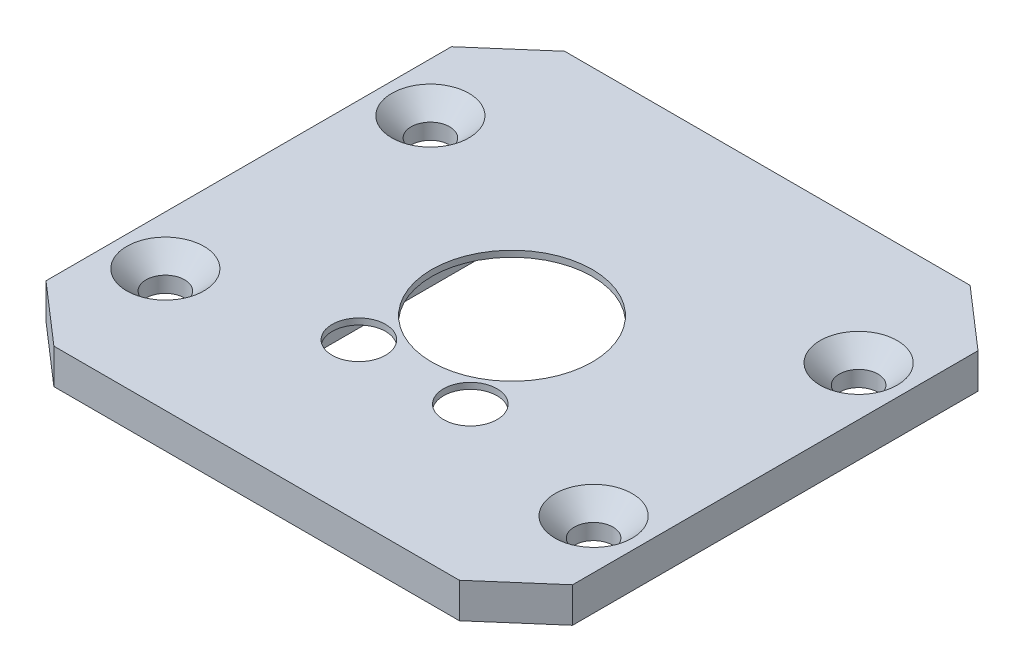
ISO-10303-21;
HEADER;
FILE_DESCRIPTION(('STEP AP214'),'2;1');
FILE_NAME('part.step','',(''),(''),'','','');
FILE_SCHEMA(('AUTOMOTIVE_DESIGN { 1 0 10303 214 1 1 1 1 }'));
ENDSEC;
DATA;
#1=APPLICATION_CONTEXT('core data for automotive mechanical design processes');
#2=APPLICATION_PROTOCOL_DEFINITION('international standard','automotive_design',2000,#1);
#3=PRODUCT_CONTEXT('',#1,'mechanical');
#4=PRODUCT('Part','Part','',(#3));
#5=PRODUCT_RELATED_PRODUCT_CATEGORY('part','',(#4));
#6=PRODUCT_DEFINITION_FORMATION('','',#4);
#7=PRODUCT_DEFINITION_CONTEXT('part definition',#1,'design');
#8=PRODUCT_DEFINITION('design','',#6,#7);
#9=PRODUCT_DEFINITION_SHAPE('','',#8);
#10=(LENGTH_UNIT() NAMED_UNIT(*) SI_UNIT(.MILLI.,.METRE.));
#11=(NAMED_UNIT(*) PLANE_ANGLE_UNIT() SI_UNIT($,.RADIAN.));
#12=(NAMED_UNIT(*) SI_UNIT($,.STERADIAN.) SOLID_ANGLE_UNIT());
#13=UNCERTAINTY_MEASURE_WITH_UNIT(LENGTH_MEASURE(1.E-05),#10,'distance_accuracy_value','');
#14=(GEOMETRIC_REPRESENTATION_CONTEXT(3) GLOBAL_UNCERTAINTY_ASSIGNED_CONTEXT((#13)) GLOBAL_UNIT_ASSIGNED_CONTEXT((#10,
#11,#12)) REPRESENTATION_CONTEXT('',''));
#15=CARTESIAN_POINT('',(0.,0.,0.));
#16=DIRECTION('',(0.,0.,1.));
#17=DIRECTION('',(1.,0.,0.));
#18=AXIS2_PLACEMENT_3D('',#15,#16,#17);
#19=CARTESIAN_POINT('',(0.,0.,0.));
#20=DIRECTION('',(0.,1.,0.));
#21=DIRECTION('',(0.,0.,1.));
#22=AXIS2_PLACEMENT_3D('',#19,#20,#21);
#23=PLANE('',#22);
#24=DIRECTION('',(-0.754605522163498,0.,0.656178714924794));
#25=VECTOR('',#24,1.);
#26=CARTESIAN_POINT('',(-6.6972861855531,0.,-22.7975658796558));
#27=LINE('',#26,#25);
#28=CARTESIAN_POINT('',(-6.6972861855531,0.,-22.7975658796558));
#29=VERTEX_POINT('',#28);
#30=CARTESIAN_POINT('',(-10.1472861855532,0.,-19.7975658796556));
#31=VERTEX_POINT('',#30);
#32=EDGE_CURVE('E158',#29,#31,#27,.T.);
#33=ORIENTED_EDGE('',*,*,#32,.F.);
#34=DIRECTION('',(-1.,0.,0.));
#35=VECTOR('',#34,1.);
#36=CARTESIAN_POINT('',(16.4027138144468,0.,-22.7975658796558));
#37=LINE('',#36,#35);
#38=CARTESIAN_POINT('',(16.4027138144468,0.,-22.7975658796558));
#39=VERTEX_POINT('',#38);
#40=EDGE_CURVE('E106',#39,#29,#37,.T.);
#41=ORIENTED_EDGE('',*,*,#40,.F.);
#42=DIRECTION('',(-0.754605522163498,0.,-0.656178714924794));
#43=VECTOR('',#42,1.);
#44=CARTESIAN_POINT('',(19.8527138144469,0.,-19.7975658796556));
#45=LINE('',#44,#43);
#46=CARTESIAN_POINT('',(19.8527138144469,0.,-19.7975658796556));
#47=VERTEX_POINT('',#46);
#48=EDGE_CURVE('E171',#47,#39,#45,.T.);
#49=ORIENTED_EDGE('',*,*,#48,.F.);
#50=DIRECTION('',(0.,0.,-1.));
#51=VECTOR('',#50,1.);
#52=CARTESIAN_POINT('',(19.8527138144469,0.,3.30243412034426));
#53=LINE('',#52,#51);
#54=CARTESIAN_POINT('',(19.8527138144469,0.,3.30243412034426));
#55=VERTEX_POINT('',#54);
#56=EDGE_CURVE('E146',#55,#47,#53,.T.);
#57=ORIENTED_EDGE('',*,*,#56,.F.);
#58=DIRECTION('',(0.754605522163498,0.,-0.656178714924794));
#59=VECTOR('',#58,1.);
#60=CARTESIAN_POINT('',(16.4027138144468,0.,6.30243412034437));
#61=LINE('',#60,#59);
#62=CARTESIAN_POINT('',(16.4027138144468,0.,6.30243412034437));
#63=VERTEX_POINT('',#62);
#64=EDGE_CURVE('E168',#63,#55,#61,.T.);
#65=ORIENTED_EDGE('',*,*,#64,.F.);
#66=DIRECTION('',(1.,0.,0.));
#67=VECTOR('',#66,1.);
#68=CARTESIAN_POINT('',(-6.6972861855531,0.,6.30243412034437));
#69=LINE('',#68,#67);
#70=CARTESIAN_POINT('',(-6.6972861855531,0.,6.30243412034437));
#71=VERTEX_POINT('',#70);
#72=EDGE_CURVE('E166',#71,#63,#69,.T.);
#73=ORIENTED_EDGE('',*,*,#72,.F.);
#74=DIRECTION('',(0.754605522163498,0.,0.656178714924794));
#75=VECTOR('',#74,1.);
#76=CARTESIAN_POINT('',(-10.1472861855532,0.,3.30243412034426));
#77=LINE('',#76,#75);
#78=CARTESIAN_POINT('',(-10.1472861855532,0.,3.30243412034426));
#79=VERTEX_POINT('',#78);
#80=EDGE_CURVE('E164',#79,#71,#77,.T.);
#81=ORIENTED_EDGE('',*,*,#80,.F.);
#82=DIRECTION('',(0.,0.,1.));
#83=VECTOR('',#82,1.);
#84=CARTESIAN_POINT('',(-10.1472861855532,0.,-19.7975658796556));
#85=LINE('',#84,#83);
#86=EDGE_CURVE('E161',#31,#79,#85,.T.);
#87=ORIENTED_EDGE('',*,*,#86,.F.);
#88=EDGE_LOOP('',(#33,#41,#49,#57,#65,#73,#81,#87));
#89=FACE_BOUND('',#88,.T.);
#90=CARTESIAN_POINT('',(-7.34728618555326,0.,-0.697565879655465));
#91=DIRECTION('',(0.,1.,0.));
#92=DIRECTION('',(0.,0.,1.));
#93=AXIS2_PLACEMENT_3D('',#90,#91,#92);
#94=CIRCLE('',#93,1.1);
#95=CARTESIAN_POINT('',(-7.34728618555326,0.,0.402434120344534));
#96=VERTEX_POINT('',#95);
#97=EDGE_CURVE('E162',#96,#96,#94,.T.);
#98=ORIENTED_EDGE('',*,*,#97,.T.);
#99=EDGE_LOOP('',(#98));
#100=FACE_BOUND('',#99,.T.);
#101=CARTESIAN_POINT('',(17.0527138144468,0.,-0.697565879655465));
#102=DIRECTION('',(0.,1.,0.));
#103=DIRECTION('',(0.,0.,1.));
#104=AXIS2_PLACEMENT_3D('',#101,#102,#103);
#105=CIRCLE('',#104,1.1);
#106=CARTESIAN_POINT('',(17.0527138144468,0.,0.402434120344535));
#107=VERTEX_POINT('',#106);
#108=EDGE_CURVE('E189',#107,#107,#105,.T.);
#109=ORIENTED_EDGE('',*,*,#108,.T.);
#110=EDGE_LOOP('',(#109));
#111=FACE_BOUND('',#110,.T.);
#112=CARTESIAN_POINT('',(17.0527138144468,0.,-15.7975658796555));
#113=DIRECTION('',(0.,1.,0.));
#114=DIRECTION('',(0.,0.,1.));
#115=AXIS2_PLACEMENT_3D('',#112,#113,#114);
#116=CIRCLE('',#115,1.1);
#117=CARTESIAN_POINT('',(17.0527138144468,0.,-14.6975658796555));
#118=VERTEX_POINT('',#117);
#119=EDGE_CURVE('E193',#118,#118,#116,.T.);
#120=ORIENTED_EDGE('',*,*,#119,.T.);
#121=EDGE_LOOP('',(#120));
#122=FACE_BOUND('',#121,.T.);
#123=CARTESIAN_POINT('',(-7.34728618555326,0.,-15.7975658796555));
#124=DIRECTION('',(0.,1.,0.));
#125=DIRECTION('',(0.,0.,1.));
#126=AXIS2_PLACEMENT_3D('',#123,#124,#125);
#127=CIRCLE('',#126,1.1);
#128=CARTESIAN_POINT('',(-7.34728618555326,0.,-14.6975658796555));
#129=VERTEX_POINT('',#128);
#130=EDGE_CURVE('E51',#129,#129,#127,.T.);
#131=ORIENTED_EDGE('',*,*,#130,.T.);
#132=EDGE_LOOP('',(#131));
#133=FACE_BOUND('',#132,.T.);
#134=DIRECTION('',(0.,0.,1.));
#135=VECTOR('',#134,1.);
#136=CARTESIAN_POINT('',(-0.89728618555315,0.,-16.7975658796557));
#137=LINE('',#136,#135);
#138=CARTESIAN_POINT('',(-0.89728618555315,0.,-16.7975658796557));
#139=VERTEX_POINT('',#138);
#140=CARTESIAN_POINT('',(-0.897286185553148,0.,0.302434120344305));
#141=VERTEX_POINT('',#140);
#142=EDGE_CURVE('E64',#139,#141,#137,.T.);
#143=ORIENTED_EDGE('',*,*,#142,.T.);
#144=DIRECTION('',(1.,0.,0.));
#145=VECTOR('',#144,1.);
#146=CARTESIAN_POINT('',(10.6027138144469,0.,0.302434120344303));
#147=LINE('',#146,#145);
#148=CARTESIAN_POINT('',(10.6027138144469,0.,0.302434120344303));
#149=VERTEX_POINT('',#148);
#150=EDGE_CURVE('E483',#141,#149,#147,.T.);
#151=ORIENTED_EDGE('',*,*,#150,.T.);
#152=DIRECTION('',(0.,0.,-1.));
#153=VECTOR('',#152,1.);
#154=CARTESIAN_POINT('',(10.6027138144468,0.,-16.7975658796557));
#155=LINE('',#154,#153);
#156=CARTESIAN_POINT('',(10.6027138144468,0.,-16.7975658796557));
#157=VERTEX_POINT('',#156);
#158=EDGE_CURVE('E486',#149,#157,#155,.T.);
#159=ORIENTED_EDGE('',*,*,#158,.T.);
#160=DIRECTION('',(-1.,0.,0.));
#161=VECTOR('',#160,1.);
#162=CARTESIAN_POINT('',(10.6027138144468,0.,-16.7975658796557));
#163=LINE('',#162,#161);
#164=EDGE_CURVE('E472',#157,#139,#163,.T.);
#165=ORIENTED_EDGE('',*,*,#164,.T.);
#166=EDGE_LOOP('',(#143,#151,#159,#165));
#167=FACE_BOUND('',#166,.T.);
#168=ADVANCED_FACE('F47',(#89,#100,#111,#122,#133,#167),#23,.F.);
#169=CARTESIAN_POINT('',(-6.6972861855531,2.,-22.7975658796558));
#170=DIRECTION('',(0.656178714924794,0.,0.754605522163498));
#171=DIRECTION('',(0.754605522163498,0.,-0.656178714924794));
#172=AXIS2_PLACEMENT_3D('',#169,#170,#171);
#173=PLANE('',#172);
#174=ORIENTED_EDGE('',*,*,#32,.T.);
#175=DIRECTION('',(0.,-1.,0.));
#176=VECTOR('',#175,1.);
#177=CARTESIAN_POINT('',(-10.1472861855532,2.,-19.7975658796556));
#178=LINE('',#177,#176);
#179=CARTESIAN_POINT('',(-10.1472861855532,2.,-19.7975658796556));
#180=VERTEX_POINT('',#179);
#181=EDGE_CURVE('E11',#180,#31,#178,.T.);
#182=ORIENTED_EDGE('',*,*,#181,.F.);
#183=DIRECTION('',(-0.754605522163498,0.,0.656178714924794));
#184=VECTOR('',#183,1.);
#185=CARTESIAN_POINT('',(-6.6972861855531,2.,-22.7975658796558));
#186=LINE('',#185,#184);
#187=CARTESIAN_POINT('',(-6.6972861855531,2.,-22.7975658796558));
#188=VERTEX_POINT('',#187);
#189=EDGE_CURVE('E174',#188,#180,#186,.T.);
#190=ORIENTED_EDGE('',*,*,#189,.F.);
#191=DIRECTION('',(0.,-1.,0.));
#192=VECTOR('',#191,1.);
#193=CARTESIAN_POINT('',(-6.6972861855531,2.,-22.7975658796558));
#194=LINE('',#193,#192);
#195=EDGE_CURVE('E154',#188,#29,#194,.T.);
#196=ORIENTED_EDGE('',*,*,#195,.T.);
#197=EDGE_LOOP('',(#174,#182,#190,#196));
#198=FACE_BOUND('',#197,.T.);
#199=ADVANCED_FACE('F49',(#198),#173,.F.);
#200=CARTESIAN_POINT('',(-10.1472861855532,2.,-19.7975658796556));
#201=DIRECTION('',(1.,0.,0.));
#202=DIRECTION('',(0.,0.,-1.));
#203=AXIS2_PLACEMENT_3D('',#200,#201,#202);
#204=PLANE('',#203);
#205=ORIENTED_EDGE('',*,*,#86,.T.);
#206=DIRECTION('',(0.,-1.,0.));
#207=VECTOR('',#206,1.);
#208=CARTESIAN_POINT('',(-10.1472861855532,2.,3.30243412034426));
#209=LINE('',#208,#207);
#210=CARTESIAN_POINT('',(-10.1472861855532,2.,3.30243412034426));
#211=VERTEX_POINT('',#210);
#212=EDGE_CURVE('E56',#211,#79,#209,.T.);
#213=ORIENTED_EDGE('',*,*,#212,.F.);
#214=DIRECTION('',(0.,0.,1.));
#215=VECTOR('',#214,1.);
#216=CARTESIAN_POINT('',(-10.1472861855532,2.,-19.7975658796556));
#217=LINE('',#216,#215);
#218=EDGE_CURVE('E114',#180,#211,#217,.T.);
#219=ORIENTED_EDGE('',*,*,#218,.F.);
#220=ORIENTED_EDGE('',*,*,#181,.T.);
#221=EDGE_LOOP('',(#205,#213,#219,#220));
#222=FACE_BOUND('',#221,.T.);
#223=ADVANCED_FACE('F238',(#222),#204,.F.);
#224=CARTESIAN_POINT('',(-10.1472861855532,2.,3.30243412034426));
#225=DIRECTION('',(0.656178714924794,0.,-0.754605522163498));
#226=DIRECTION('',(-0.754605522163498,0.,-0.656178714924794));
#227=AXIS2_PLACEMENT_3D('',#224,#225,#226);
#228=PLANE('',#227);
#229=ORIENTED_EDGE('',*,*,#80,.T.);
#230=DIRECTION('',(0.,-1.,0.));
#231=VECTOR('',#230,1.);
#232=CARTESIAN_POINT('',(-6.6972861855531,2.,6.30243412034437));
#233=LINE('',#232,#231);
#234=CARTESIAN_POINT('',(-6.6972861855531,2.,6.30243412034437));
#235=VERTEX_POINT('',#234);
#236=EDGE_CURVE('E181',#235,#71,#233,.T.);
#237=ORIENTED_EDGE('',*,*,#236,.F.);
#238=DIRECTION('',(0.754605522163498,0.,0.656178714924794));
#239=VECTOR('',#238,1.);
#240=CARTESIAN_POINT('',(-10.1472861855532,2.,3.30243412034426));
#241=LINE('',#240,#239);
#242=EDGE_CURVE('E218',#211,#235,#241,.T.);
#243=ORIENTED_EDGE('',*,*,#242,.F.);
#244=ORIENTED_EDGE('',*,*,#212,.T.);
#245=EDGE_LOOP('',(#229,#237,#243,#244));
#246=FACE_BOUND('',#245,.T.);
#247=ADVANCED_FACE('F241',(#246),#228,.F.);
#248=CARTESIAN_POINT('',(-6.6972861855531,2.,6.30243412034437));
#249=DIRECTION('',(0.,0.,-1.));
#250=DIRECTION('',(-1.,0.,0.));
#251=AXIS2_PLACEMENT_3D('',#248,#249,#250);
#252=PLANE('',#251);
#253=ORIENTED_EDGE('',*,*,#72,.T.);
#254=DIRECTION('',(0.,-1.,0.));
#255=VECTOR('',#254,1.);
#256=CARTESIAN_POINT('',(16.4027138144468,2.,6.30243412034437));
#257=LINE('',#256,#255);
#258=CARTESIAN_POINT('',(16.4027138144468,2.,6.30243412034437));
#259=VERTEX_POINT('',#258);
#260=EDGE_CURVE('E178',#259,#63,#257,.T.);
#261=ORIENTED_EDGE('',*,*,#260,.F.);
#262=DIRECTION('',(1.,0.,0.));
#263=VECTOR('',#262,1.);
#264=CARTESIAN_POINT('',(-6.6972861855531,2.,6.30243412034437));
#265=LINE('',#264,#263);
#266=EDGE_CURVE('E220',#235,#259,#265,.T.);
#267=ORIENTED_EDGE('',*,*,#266,.F.);
#268=ORIENTED_EDGE('',*,*,#236,.T.);
#269=EDGE_LOOP('',(#253,#261,#267,#268));
#270=FACE_BOUND('',#269,.T.);
#271=ADVANCED_FACE('F226',(#270),#252,.F.);
#272=CARTESIAN_POINT('',(16.4027138144468,2.,6.30243412034437));
#273=DIRECTION('',(-0.656178714924794,0.,-0.754605522163498));
#274=DIRECTION('',(-0.754605522163498,0.,0.656178714924794));
#275=AXIS2_PLACEMENT_3D('',#272,#273,#274);
#276=PLANE('',#275);
#277=ORIENTED_EDGE('',*,*,#64,.T.);
#278=DIRECTION('',(0.,-1.,0.));
#279=VECTOR('',#278,1.);
#280=CARTESIAN_POINT('',(19.8527138144469,2.,3.30243412034426));
#281=LINE('',#280,#279);
#282=CARTESIAN_POINT('',(19.8527138144469,2.,3.30243412034426));
#283=VERTEX_POINT('',#282);
#284=EDGE_CURVE('E149',#283,#55,#281,.T.);
#285=ORIENTED_EDGE('',*,*,#284,.F.);
#286=DIRECTION('',(0.754605522163498,0.,-0.656178714924794));
#287=VECTOR('',#286,1.);
#288=CARTESIAN_POINT('',(16.4027138144468,2.,6.30243412034437));
#289=LINE('',#288,#287);
#290=EDGE_CURVE('E137',#259,#283,#289,.T.);
#291=ORIENTED_EDGE('',*,*,#290,.F.);
#292=ORIENTED_EDGE('',*,*,#260,.T.);
#293=EDGE_LOOP('',(#277,#285,#291,#292));
#294=FACE_BOUND('',#293,.T.);
#295=ADVANCED_FACE('F230',(#294),#276,.F.);
#296=CARTESIAN_POINT('',(19.8527138144469,2.,3.30243412034426));
#297=DIRECTION('',(-1.,0.,0.));
#298=DIRECTION('',(0.,0.,1.));
#299=AXIS2_PLACEMENT_3D('',#296,#297,#298);
#300=PLANE('',#299);
#301=ORIENTED_EDGE('',*,*,#56,.T.);
#302=DIRECTION('',(0.,-1.,0.));
#303=VECTOR('',#302,1.);
#304=CARTESIAN_POINT('',(19.8527138144469,2.,-19.7975658796556));
#305=LINE('',#304,#303);
#306=CARTESIAN_POINT('',(19.8527138144469,2.,-19.7975658796556));
#307=VERTEX_POINT('',#306);
#308=EDGE_CURVE('E143',#307,#47,#305,.T.);
#309=ORIENTED_EDGE('',*,*,#308,.F.);
#310=DIRECTION('',(0.,0.,-1.));
#311=VECTOR('',#310,1.);
#312=CARTESIAN_POINT('',(19.8527138144469,2.,3.30243412034426));
#313=LINE('',#312,#311);
#314=EDGE_CURVE('E130',#283,#307,#313,.T.);
#315=ORIENTED_EDGE('',*,*,#314,.F.);
#316=ORIENTED_EDGE('',*,*,#284,.T.);
#317=EDGE_LOOP('',(#301,#309,#315,#316));
#318=FACE_BOUND('',#317,.T.);
#319=ADVANCED_FACE('F144',(#318),#300,.F.);
#320=CARTESIAN_POINT('',(19.8527138144469,2.,-19.7975658796556));
#321=DIRECTION('',(-0.656178714924794,0.,0.754605522163498));
#322=DIRECTION('',(0.754605522163498,0.,0.656178714924794));
#323=AXIS2_PLACEMENT_3D('',#320,#321,#322);
#324=PLANE('',#323);
#325=ORIENTED_EDGE('',*,*,#48,.T.);
#326=DIRECTION('',(0.,-1.,0.));
#327=VECTOR('',#326,1.);
#328=CARTESIAN_POINT('',(16.4027138144468,2.,-22.7975658796558));
#329=LINE('',#328,#327);
#330=CARTESIAN_POINT('',(16.4027138144468,2.,-22.7975658796558));
#331=VERTEX_POINT('',#330);
#332=EDGE_CURVE('E150',#331,#39,#329,.T.);
#333=ORIENTED_EDGE('',*,*,#332,.F.);
#334=DIRECTION('',(-0.754605522163498,0.,-0.656178714924794));
#335=VECTOR('',#334,1.);
#336=CARTESIAN_POINT('',(19.8527138144469,2.,-19.7975658796556));
#337=LINE('',#336,#335);
#338=EDGE_CURVE('E134',#307,#331,#337,.T.);
#339=ORIENTED_EDGE('',*,*,#338,.F.);
#340=ORIENTED_EDGE('',*,*,#308,.T.);
#341=EDGE_LOOP('',(#325,#333,#339,#340));
#342=FACE_BOUND('',#341,.T.);
#343=ADVANCED_FACE('F152',(#342),#324,.F.);
#344=CARTESIAN_POINT('',(16.4027138144468,2.,-22.7975658796558));
#345=DIRECTION('',(0.,0.,1.));
#346=DIRECTION('',(1.,0.,0.));
#347=AXIS2_PLACEMENT_3D('',#344,#345,#346);
#348=PLANE('',#347);
#349=ORIENTED_EDGE('',*,*,#40,.T.);
#350=ORIENTED_EDGE('',*,*,#195,.F.);
#351=DIRECTION('',(-1.,0.,0.));
#352=VECTOR('',#351,1.);
#353=CARTESIAN_POINT('',(16.4027138144468,2.,-22.7975658796558));
#354=LINE('',#353,#352);
#355=EDGE_CURVE('E73',#331,#188,#354,.T.);
#356=ORIENTED_EDGE('',*,*,#355,.F.);
#357=ORIENTED_EDGE('',*,*,#332,.T.);
#358=EDGE_LOOP('',(#349,#350,#356,#357));
#359=FACE_BOUND('',#358,.T.);
#360=ADVANCED_FACE('F234',(#359),#348,.F.);
#361=CARTESIAN_POINT('',(0.,2.,0.));
#362=DIRECTION('',(0.,1.,0.));
#363=DIRECTION('',(0.,0.,1.));
#364=AXIS2_PLACEMENT_3D('',#361,#362,#363);
#365=PLANE('',#364);
#366=CARTESIAN_POINT('',(1.67771381444685,2.,-2.6975658796557));
#367=DIRECTION('',(0.,-1.,0.));
#368=DIRECTION('',(0.,0.,-1.));
#369=AXIS2_PLACEMENT_3D('',#366,#367,#368);
#370=CIRCLE('',#369,1.524);
#371=CARTESIAN_POINT('',(1.67771381444685,2.,-4.2215658796557));
#372=VERTEX_POINT('',#371);
#373=EDGE_CURVE('E543',#372,#372,#370,.T.);
#374=ORIENTED_EDGE('',*,*,#373,.T.);
#375=EDGE_LOOP('',(#374));
#376=FACE_BOUND('',#375,.T.);
#377=CARTESIAN_POINT('',(8.02771381444685,2.,-2.6975658796557));
#378=DIRECTION('',(0.,-1.,0.));
#379=DIRECTION('',(0.,0.,-1.));
#380=AXIS2_PLACEMENT_3D('',#377,#378,#379);
#381=CIRCLE('',#380,1.524);
#382=CARTESIAN_POINT('',(8.02771381444685,2.,-4.22156587965569));
#383=VERTEX_POINT('',#382);
#384=EDGE_CURVE('E464',#383,#383,#381,.T.);
#385=ORIENTED_EDGE('',*,*,#384,.T.);
#386=EDGE_LOOP('',(#385));
#387=FACE_BOUND('',#386,.T.);
#388=CARTESIAN_POINT('',(4.85271381444685,2.,-8.2475658796557));
#389=DIRECTION('',(0.,-1.,0.));
#390=DIRECTION('',(0.,0.,-1.));
#391=AXIS2_PLACEMENT_3D('',#388,#389,#390);
#392=CIRCLE('',#391,4.572);
#393=CARTESIAN_POINT('',(4.85271381444685,2.,-12.8195658796557));
#394=VERTEX_POINT('',#393);
#395=EDGE_CURVE('E456',#394,#394,#392,.T.);
#396=ORIENTED_EDGE('',*,*,#395,.T.);
#397=EDGE_LOOP('',(#396));
#398=FACE_BOUND('',#397,.T.);
#399=CARTESIAN_POINT('',(-7.34728618555326,2.,-15.7975658796555));
#400=DIRECTION('',(0.,1.,0.));
#401=DIRECTION('',(0.,0.,1.));
#402=AXIS2_PLACEMENT_3D('',#399,#400,#401);
#403=CIRCLE('',#402,2.2);
#404=CARTESIAN_POINT('',(-7.34728618555326,2.,-13.5975658796555));
#405=VERTEX_POINT('',#404);
#406=EDGE_CURVE('E500',#405,#405,#403,.T.);
#407=ORIENTED_EDGE('',*,*,#406,.F.);
#408=EDGE_LOOP('',(#407));
#409=FACE_BOUND('',#408,.T.);
#410=CARTESIAN_POINT('',(17.0527138144468,2.,-15.7975658796555));
#411=DIRECTION('',(0.,1.,0.));
#412=DIRECTION('',(0.,0.,1.));
#413=AXIS2_PLACEMENT_3D('',#410,#411,#412);
#414=CIRCLE('',#413,2.2);
#415=CARTESIAN_POINT('',(17.0527138144468,2.,-13.5975658796555));
#416=VERTEX_POINT('',#415);
#417=EDGE_CURVE('E202',#416,#416,#414,.T.);
#418=ORIENTED_EDGE('',*,*,#417,.F.);
#419=EDGE_LOOP('',(#418));
#420=FACE_BOUND('',#419,.T.);
#421=CARTESIAN_POINT('',(17.0527138144468,2.,-0.697565879655465));
#422=DIRECTION('',(0.,1.,0.));
#423=DIRECTION('',(0.,0.,1.));
#424=AXIS2_PLACEMENT_3D('',#421,#422,#423);
#425=CIRCLE('',#424,2.2);
#426=CARTESIAN_POINT('',(17.0527138144468,2.,1.50243412034454));
#427=VERTEX_POINT('',#426);
#428=EDGE_CURVE('E195',#427,#427,#425,.T.);
#429=ORIENTED_EDGE('',*,*,#428,.F.);
#430=EDGE_LOOP('',(#429));
#431=FACE_BOUND('',#430,.T.);
#432=CARTESIAN_POINT('',(-7.34728618555326,2.,-0.697565879655465));
#433=DIRECTION('',(0.,1.,0.));
#434=DIRECTION('',(0.,0.,1.));
#435=AXIS2_PLACEMENT_3D('',#432,#433,#434);
#436=CIRCLE('',#435,2.2);
#437=CARTESIAN_POINT('',(-7.34728618555326,2.,1.50243412034454));
#438=VERTEX_POINT('',#437);
#439=EDGE_CURVE('E191',#438,#438,#436,.T.);
#440=ORIENTED_EDGE('',*,*,#439,.F.);
#441=EDGE_LOOP('',(#440));
#442=FACE_BOUND('',#441,.T.);
#443=ORIENTED_EDGE('',*,*,#189,.T.);
#444=ORIENTED_EDGE('',*,*,#218,.T.);
#445=ORIENTED_EDGE('',*,*,#242,.T.);
#446=ORIENTED_EDGE('',*,*,#266,.T.);
#447=ORIENTED_EDGE('',*,*,#290,.T.);
#448=ORIENTED_EDGE('',*,*,#314,.T.);
#449=ORIENTED_EDGE('',*,*,#338,.T.);
#450=ORIENTED_EDGE('',*,*,#355,.T.);
#451=EDGE_LOOP('',(#443,#444,#445,#446,#447,#448,#449,#450));
#452=FACE_BOUND('',#451,.T.);
#453=ADVANCED_FACE('F132',(#376,#387,#398,#409,#420,#431,#442,#452),#365,.T.);
#454=CARTESIAN_POINT('',(-7.34728618555326,2.,-0.697565879655465));
#455=DIRECTION('',(0.,1.,0.));
#456=DIRECTION('',(0.,0.,1.));
#457=AXIS2_PLACEMENT_3D('',#454,#455,#456);
#458=CYLINDRICAL_SURFACE('',#457,1.1);
#459=CARTESIAN_POINT('',(-7.34728618555326,0.9,-0.697565879655465));
#460=DIRECTION('',(0.,1.,0.));
#461=DIRECTION('',(0.,0.,1.));
#462=AXIS2_PLACEMENT_3D('',#459,#460,#461);
#463=CIRCLE('',#462,1.1);
#464=CARTESIAN_POINT('',(-7.34728618555326,0.9,0.402434120344534));
#465=VERTEX_POINT('',#464);
#466=EDGE_CURVE('E188',#465,#465,#463,.T.);
#467=ORIENTED_EDGE('',*,*,#466,.T.);
#468=EDGE_LOOP('',(#467));
#469=FACE_BOUND('',#468,.T.);
#470=ORIENTED_EDGE('',*,*,#97,.F.);
#471=EDGE_LOOP('',(#470));
#472=FACE_BOUND('',#471,.T.);
#473=ADVANCED_FACE('F286',(#469,#472),#458,.F.);
#474=CARTESIAN_POINT('',(-7.34728618555326,2.,-0.697565879655465));
#475=DIRECTION('',(0.,1.,0.));
#476=DIRECTION('',(0.,0.,1.));
#477=AXIS2_PLACEMENT_3D('',#474,#475,#476);
#478=CONICAL_SURFACE('',#477,2.2,0.785398163397448);
#479=ORIENTED_EDGE('',*,*,#466,.F.);
#480=EDGE_LOOP('',(#479));
#481=FACE_BOUND('',#480,.T.);
#482=ORIENTED_EDGE('',*,*,#439,.T.);
#483=EDGE_LOOP('',(#482));
#484=FACE_BOUND('',#483,.T.);
#485=ADVANCED_FACE('F293',(#481,#484),#478,.F.);
#486=CARTESIAN_POINT('',(17.0527138144468,2.,-0.697565879655465));
#487=DIRECTION('',(0.,1.,0.));
#488=DIRECTION('',(0.,0.,1.));
#489=AXIS2_PLACEMENT_3D('',#486,#487,#488);
#490=CYLINDRICAL_SURFACE('',#489,1.1);
#491=CARTESIAN_POINT('',(17.0527138144468,0.9,-0.697565879655465));
#492=DIRECTION('',(0.,1.,0.));
#493=DIRECTION('',(0.,0.,1.));
#494=AXIS2_PLACEMENT_3D('',#491,#492,#493);
#495=CIRCLE('',#494,1.1);
#496=CARTESIAN_POINT('',(17.0527138144468,0.9,0.402434120344535));
#497=VERTEX_POINT('',#496);
#498=EDGE_CURVE('E192',#497,#497,#495,.T.);
#499=ORIENTED_EDGE('',*,*,#498,.T.);
#500=EDGE_LOOP('',(#499));
#501=FACE_BOUND('',#500,.T.);
#502=ORIENTED_EDGE('',*,*,#108,.F.);
#503=EDGE_LOOP('',(#502));
#504=FACE_BOUND('',#503,.T.);
#505=ADVANCED_FACE('F300',(#501,#504),#490,.F.);
#506=CARTESIAN_POINT('',(17.0527138144468,2.,-0.697565879655465));
#507=DIRECTION('',(0.,1.,0.));
#508=DIRECTION('',(0.,0.,1.));
#509=AXIS2_PLACEMENT_3D('',#506,#507,#508);
#510=CONICAL_SURFACE('',#509,2.2,0.785398163397448);
#511=ORIENTED_EDGE('',*,*,#498,.F.);
#512=EDGE_LOOP('',(#511));
#513=FACE_BOUND('',#512,.T.);
#514=ORIENTED_EDGE('',*,*,#428,.T.);
#515=EDGE_LOOP('',(#514));
#516=FACE_BOUND('',#515,.T.);
#517=ADVANCED_FACE('F308',(#513,#516),#510,.F.);
#518=CARTESIAN_POINT('',(17.0527138144468,2.,-15.7975658796555));
#519=DIRECTION('',(0.,1.,0.));
#520=DIRECTION('',(0.,0.,1.));
#521=AXIS2_PLACEMENT_3D('',#518,#519,#520);
#522=CYLINDRICAL_SURFACE('',#521,1.1);
#523=CARTESIAN_POINT('',(17.0527138144468,0.9,-15.7975658796555));
#524=DIRECTION('',(0.,1.,0.));
#525=DIRECTION('',(0.,0.,1.));
#526=AXIS2_PLACEMENT_3D('',#523,#524,#525);
#527=CIRCLE('',#526,1.1);
#528=CARTESIAN_POINT('',(17.0527138144468,0.9,-14.6975658796555));
#529=VERTEX_POINT('',#528);
#530=EDGE_CURVE('E196',#529,#529,#527,.T.);
#531=ORIENTED_EDGE('',*,*,#530,.T.);
#532=EDGE_LOOP('',(#531));
#533=FACE_BOUND('',#532,.T.);
#534=ORIENTED_EDGE('',*,*,#119,.F.);
#535=EDGE_LOOP('',(#534));
#536=FACE_BOUND('',#535,.T.);
#537=ADVANCED_FACE('F316',(#533,#536),#522,.F.);
#538=CARTESIAN_POINT('',(17.0527138144468,2.,-15.7975658796555));
#539=DIRECTION('',(0.,1.,0.));
#540=DIRECTION('',(0.,0.,1.));
#541=AXIS2_PLACEMENT_3D('',#538,#539,#540);
#542=CONICAL_SURFACE('',#541,2.2,0.785398163397448);
#543=ORIENTED_EDGE('',*,*,#530,.F.);
#544=EDGE_LOOP('',(#543));
#545=FACE_BOUND('',#544,.T.);
#546=ORIENTED_EDGE('',*,*,#417,.T.);
#547=EDGE_LOOP('',(#546));
#548=FACE_BOUND('',#547,.T.);
#549=ADVANCED_FACE('F324',(#545,#548),#542,.F.);
#550=CARTESIAN_POINT('',(-7.34728618555326,2.,-15.7975658796555));
#551=DIRECTION('',(0.,1.,0.));
#552=DIRECTION('',(0.,0.,1.));
#553=AXIS2_PLACEMENT_3D('',#550,#551,#552);
#554=CYLINDRICAL_SURFACE('',#553,1.1);
#555=CARTESIAN_POINT('',(-7.34728618555326,0.9,-15.7975658796555));
#556=DIRECTION('',(0.,1.,0.));
#557=DIRECTION('',(0.,0.,1.));
#558=AXIS2_PLACEMENT_3D('',#555,#556,#557);
#559=CIRCLE('',#558,1.1);
#560=CARTESIAN_POINT('',(-7.34728618555326,0.9,-14.6975658796555));
#561=VERTEX_POINT('',#560);
#562=EDGE_CURVE('E502',#561,#561,#559,.T.);
#563=ORIENTED_EDGE('',*,*,#562,.T.);
#564=EDGE_LOOP('',(#563));
#565=FACE_BOUND('',#564,.T.);
#566=ORIENTED_EDGE('',*,*,#130,.F.);
#567=EDGE_LOOP('',(#566));
#568=FACE_BOUND('',#567,.T.);
#569=ADVANCED_FACE('F331',(#565,#568),#554,.F.);
#570=CARTESIAN_POINT('',(-7.34728618555326,2.,-15.7975658796555));
#571=DIRECTION('',(0.,1.,0.));
#572=DIRECTION('',(0.,0.,1.));
#573=AXIS2_PLACEMENT_3D('',#570,#571,#572);
#574=CONICAL_SURFACE('',#573,2.2,0.785398163397448);
#575=ORIENTED_EDGE('',*,*,#562,.F.);
#576=EDGE_LOOP('',(#575));
#577=FACE_BOUND('',#576,.T.);
#578=ORIENTED_EDGE('',*,*,#406,.T.);
#579=EDGE_LOOP('',(#578));
#580=FACE_BOUND('',#579,.T.);
#581=ADVANCED_FACE('F339',(#577,#580),#574,.F.);
#582=CARTESIAN_POINT('',(-0.89728618555315,1.651,-16.7975658796557));
#583=DIRECTION('',(1.,0.,0.));
#584=DIRECTION('',(0.,0.,-1.));
#585=AXIS2_PLACEMENT_3D('',#582,#583,#584);
#586=PLANE('',#585);
#587=ORIENTED_EDGE('',*,*,#142,.F.);
#588=DIRECTION('',(0.,-1.,0.));
#589=VECTOR('',#588,1.);
#590=CARTESIAN_POINT('',(-0.89728618555315,1.651,-16.7975658796557));
#591=LINE('',#590,#589);
#592=CARTESIAN_POINT('',(-0.89728618555315,1.651,-16.7975658796557));
#593=VERTEX_POINT('',#592);
#594=EDGE_CURVE('E481',#593,#139,#591,.T.);
#595=ORIENTED_EDGE('',*,*,#594,.F.);
#596=DIRECTION('',(0.,0.,1.));
#597=VECTOR('',#596,1.);
#598=CARTESIAN_POINT('',(-0.89728618555315,1.651,-16.7975658796557));
#599=LINE('',#598,#597);
#600=CARTESIAN_POINT('',(-0.897286185553148,1.651,0.302434120344305));
#601=VERTEX_POINT('',#600);
#602=EDGE_CURVE('E468',#593,#601,#599,.T.);
#603=ORIENTED_EDGE('',*,*,#602,.T.);
#604=DIRECTION('',(0.,-1.,0.));
#605=VECTOR('',#604,1.);
#606=CARTESIAN_POINT('',(-0.897286185553148,1.651,0.302434120344305));
#607=LINE('',#606,#605);
#608=EDGE_CURVE('E498',#601,#141,#607,.T.);
#609=ORIENTED_EDGE('',*,*,#608,.T.);
#610=EDGE_LOOP('',(#587,#595,#603,#609));
#611=FACE_BOUND('',#610,.T.);
#612=ADVANCED_FACE('F346',(#611),#586,.T.);
#613=CARTESIAN_POINT('',(10.6027138144469,1.651,0.302434120344303));
#614=DIRECTION('',(0.,0.,-1.));
#615=DIRECTION('',(-1.,0.,0.));
#616=AXIS2_PLACEMENT_3D('',#613,#614,#615);
#617=PLANE('',#616);
#618=ORIENTED_EDGE('',*,*,#150,.F.);
#619=ORIENTED_EDGE('',*,*,#608,.F.);
#620=DIRECTION('',(1.,0.,0.));
#621=VECTOR('',#620,1.);
#622=CARTESIAN_POINT('',(10.6027138144469,1.651,0.302434120344303));
#623=LINE('',#622,#621);
#624=CARTESIAN_POINT('',(10.6027138144469,1.651,0.302434120344303));
#625=VERTEX_POINT('',#624);
#626=EDGE_CURVE('E471',#601,#625,#623,.T.);
#627=ORIENTED_EDGE('',*,*,#626,.T.);
#628=DIRECTION('',(0.,-1.,0.));
#629=VECTOR('',#628,1.);
#630=CARTESIAN_POINT('',(10.6027138144469,1.651,0.302434120344303));
#631=LINE('',#630,#629);
#632=EDGE_CURVE('E495',#625,#149,#631,.T.);
#633=ORIENTED_EDGE('',*,*,#632,.T.);
#634=EDGE_LOOP('',(#618,#619,#627,#633));
#635=FACE_BOUND('',#634,.T.);
#636=ADVANCED_FACE('F371',(#635),#617,.T.);
#637=CARTESIAN_POINT('',(10.6027138144468,1.651,-16.7975658796557));
#638=DIRECTION('',(-1.,0.,0.));
#639=DIRECTION('',(0.,0.,1.));
#640=AXIS2_PLACEMENT_3D('',#637,#638,#639);
#641=PLANE('',#640);
#642=ORIENTED_EDGE('',*,*,#158,.F.);
#643=ORIENTED_EDGE('',*,*,#632,.F.);
#644=DIRECTION('',(0.,0.,-1.));
#645=VECTOR('',#644,1.);
#646=CARTESIAN_POINT('',(10.6027138144468,1.651,-16.7975658796557));
#647=LINE('',#646,#645);
#648=CARTESIAN_POINT('',(10.6027138144468,1.651,-16.7975658796557));
#649=VERTEX_POINT('',#648);
#650=EDGE_CURVE('E475',#625,#649,#647,.T.);
#651=ORIENTED_EDGE('',*,*,#650,.T.);
#652=DIRECTION('',(0.,-1.,0.));
#653=VECTOR('',#652,1.);
#654=CARTESIAN_POINT('',(10.6027138144468,1.651,-16.7975658796557));
#655=LINE('',#654,#653);
#656=EDGE_CURVE('E492',#649,#157,#655,.T.);
#657=ORIENTED_EDGE('',*,*,#656,.T.);
#658=EDGE_LOOP('',(#642,#643,#651,#657));
#659=FACE_BOUND('',#658,.T.);
#660=ADVANCED_FACE('F378',(#659),#641,.T.);
#661=CARTESIAN_POINT('',(10.6027138144468,1.651,-16.7975658796557));
#662=DIRECTION('',(0.,0.,1.));
#663=DIRECTION('',(1.,0.,0.));
#664=AXIS2_PLACEMENT_3D('',#661,#662,#663);
#665=PLANE('',#664);
#666=ORIENTED_EDGE('',*,*,#164,.F.);
#667=ORIENTED_EDGE('',*,*,#656,.F.);
#668=DIRECTION('',(-1.,0.,0.));
#669=VECTOR('',#668,1.);
#670=CARTESIAN_POINT('',(10.6027138144468,1.651,-16.7975658796557));
#671=LINE('',#670,#669);
#672=EDGE_CURVE('E478',#649,#593,#671,.T.);
#673=ORIENTED_EDGE('',*,*,#672,.T.);
#674=ORIENTED_EDGE('',*,*,#594,.T.);
#675=EDGE_LOOP('',(#666,#667,#673,#674));
#676=FACE_BOUND('',#675,.T.);
#677=ADVANCED_FACE('F387',(#676),#665,.T.);
#678=CARTESIAN_POINT('',(0.,1.651,0.));
#679=DIRECTION('',(0.,-1.,0.));
#680=DIRECTION('',(0.,0.,-1.));
#681=AXIS2_PLACEMENT_3D('',#678,#679,#680);
#682=PLANE('',#681);
#683=CARTESIAN_POINT('',(4.85271381444685,1.651,-8.2475658796557));
#684=DIRECTION('',(0.,-1.,0.));
#685=DIRECTION('',(0.,0.,-1.));
#686=AXIS2_PLACEMENT_3D('',#683,#684,#685);
#687=CIRCLE('',#686,4.572);
#688=CARTESIAN_POINT('',(4.85271381444685,1.651,-12.8195658796557));
#689=VERTEX_POINT('',#688);
#690=EDGE_CURVE('E459',#689,#689,#687,.T.);
#691=ORIENTED_EDGE('',*,*,#690,.F.);
#692=EDGE_LOOP('',(#691));
#693=FACE_BOUND('',#692,.T.);
#694=CARTESIAN_POINT('',(1.67771381444685,1.651,-2.6975658796557));
#695=DIRECTION('',(0.,-1.,0.));
#696=DIRECTION('',(0.,0.,-1.));
#697=AXIS2_PLACEMENT_3D('',#694,#695,#696);
#698=CIRCLE('',#697,1.524);
#699=CARTESIAN_POINT('',(1.67771381444685,1.651,-4.2215658796557));
#700=VERTEX_POINT('',#699);
#701=EDGE_CURVE('E546',#700,#700,#698,.T.);
#702=ORIENTED_EDGE('',*,*,#701,.F.);
#703=EDGE_LOOP('',(#702));
#704=FACE_BOUND('',#703,.T.);
#705=CARTESIAN_POINT('',(8.02771381444685,1.651,-2.6975658796557));
#706=DIRECTION('',(0.,-1.,0.));
#707=DIRECTION('',(0.,0.,-1.));
#708=AXIS2_PLACEMENT_3D('',#705,#706,#707);
#709=CIRCLE('',#708,1.524);
#710=CARTESIAN_POINT('',(8.02771381444685,1.651,-4.22156587965569));
#711=VERTEX_POINT('',#710);
#712=EDGE_CURVE('E460',#711,#711,#709,.T.);
#713=ORIENTED_EDGE('',*,*,#712,.F.);
#714=EDGE_LOOP('',(#713));
#715=FACE_BOUND('',#714,.T.);
#716=ORIENTED_EDGE('',*,*,#602,.F.);
#717=ORIENTED_EDGE('',*,*,#672,.F.);
#718=ORIENTED_EDGE('',*,*,#650,.F.);
#719=ORIENTED_EDGE('',*,*,#626,.F.);
#720=EDGE_LOOP('',(#716,#717,#718,#719));
#721=FACE_BOUND('',#720,.T.);
#722=ADVANCED_FACE('F396',(#693,#704,#715,#721),#682,.T.);
#723=CARTESIAN_POINT('',(8.02771381444685,2.,-2.6975658796557));
#724=DIRECTION('',(0.,-1.,0.));
#725=DIRECTION('',(0.,0.,-1.));
#726=AXIS2_PLACEMENT_3D('',#723,#724,#725);
#727=CYLINDRICAL_SURFACE('',#726,1.524);
#728=ORIENTED_EDGE('',*,*,#384,.F.);
#729=EDGE_LOOP('',(#728));
#730=FACE_BOUND('',#729,.T.);
#731=ORIENTED_EDGE('',*,*,#712,.T.);
#732=EDGE_LOOP('',(#731));
#733=FACE_BOUND('',#732,.T.);
#734=ADVANCED_FACE('F414',(#730,#733),#727,.F.);
#735=CARTESIAN_POINT('',(1.67771381444685,2.,-2.6975658796557));
#736=DIRECTION('',(0.,-1.,0.));
#737=DIRECTION('',(0.,0.,-1.));
#738=AXIS2_PLACEMENT_3D('',#735,#736,#737);
#739=CYLINDRICAL_SURFACE('',#738,1.524);
#740=ORIENTED_EDGE('',*,*,#373,.F.);
#741=EDGE_LOOP('',(#740));
#742=FACE_BOUND('',#741,.T.);
#743=ORIENTED_EDGE('',*,*,#701,.T.);
#744=EDGE_LOOP('',(#743));
#745=FACE_BOUND('',#744,.T.);
#746=ADVANCED_FACE('F423',(#742,#745),#739,.F.);
#747=CARTESIAN_POINT('',(4.85271381444685,2.,-8.2475658796557));
#748=DIRECTION('',(0.,-1.,0.));
#749=DIRECTION('',(0.,0.,-1.));
#750=AXIS2_PLACEMENT_3D('',#747,#748,#749);
#751=CYLINDRICAL_SURFACE('',#750,4.572);
#752=ORIENTED_EDGE('',*,*,#395,.F.);
#753=EDGE_LOOP('',(#752));
#754=FACE_BOUND('',#753,.T.);
#755=ORIENTED_EDGE('',*,*,#690,.T.);
#756=EDGE_LOOP('',(#755));
#757=FACE_BOUND('',#756,.T.);
#758=ADVANCED_FACE('F432',(#754,#757),#751,.F.);
#759=CLOSED_SHELL('',(#168,#199,#223,#247,#271,#295,#319,#343,#360,#453,#473,#485,#505,#517,
#537,#549,#569,#581,#612,#636,#660,#677,#722,#734,#746,#758));
#760=MANIFOLD_SOLID_BREP('B2',#759);
#761=ADVANCED_BREP_SHAPE_REPRESENTATION('',(#18,#760),#14);
#762=SHAPE_DEFINITION_REPRESENTATION(#9,#761);
ENDSEC;
END-ISO-10303-21;
